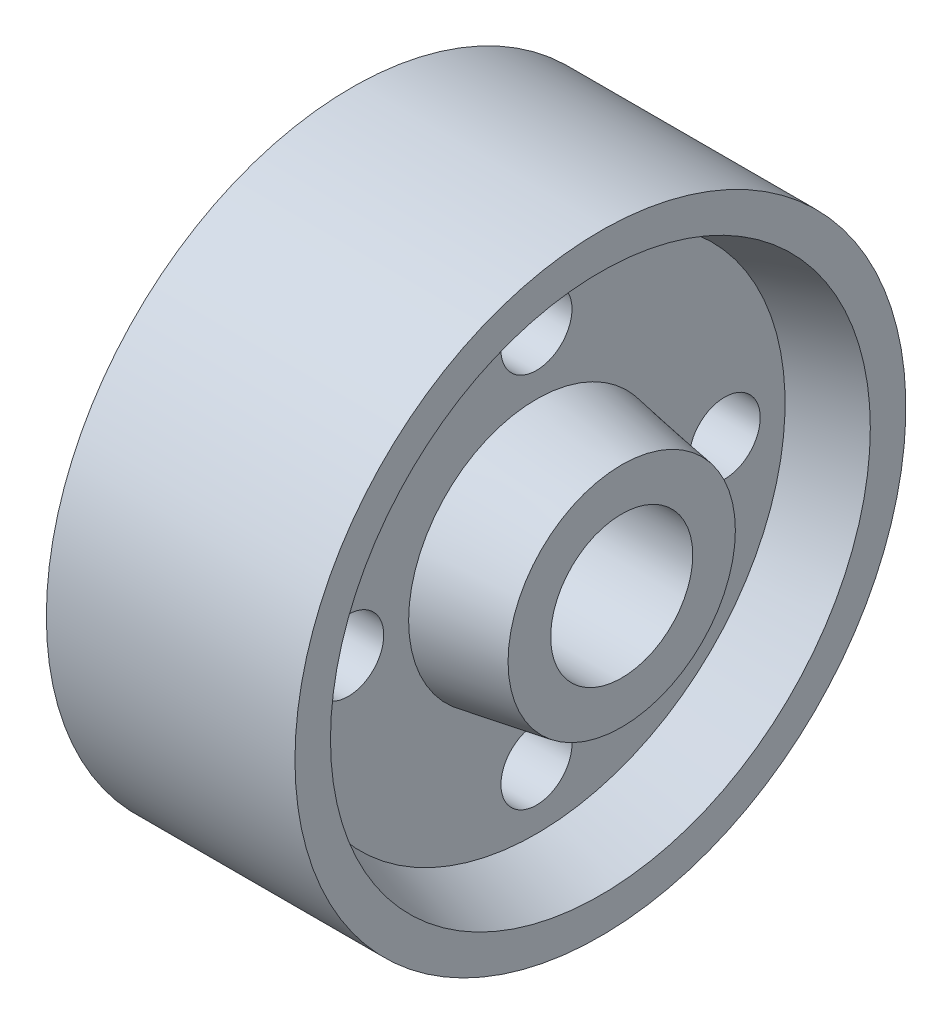
ISO-10303-21;
HEADER;
FILE_DESCRIPTION(('STEP AP214'),'2;1');
FILE_NAME('part.step','',(''),(''),'','','');
FILE_SCHEMA(('AUTOMOTIVE_DESIGN { 1 0 10303 214 1 1 1 1 }'));
ENDSEC;
DATA;
#1=APPLICATION_CONTEXT('core data for automotive mechanical design processes');
#2=APPLICATION_PROTOCOL_DEFINITION('international standard','automotive_design',2000,#1);
#3=PRODUCT_CONTEXT('',#1,'mechanical');
#4=PRODUCT('Part','Part','',(#3));
#5=PRODUCT_RELATED_PRODUCT_CATEGORY('part','',(#4));
#6=PRODUCT_DEFINITION_FORMATION('','',#4);
#7=PRODUCT_DEFINITION_CONTEXT('part definition',#1,'design');
#8=PRODUCT_DEFINITION('design','',#6,#7);
#9=PRODUCT_DEFINITION_SHAPE('','',#8);
#10=(LENGTH_UNIT() NAMED_UNIT(*) SI_UNIT(.MILLI.,.METRE.));
#11=(NAMED_UNIT(*) PLANE_ANGLE_UNIT() SI_UNIT($,.RADIAN.));
#12=(NAMED_UNIT(*) SI_UNIT($,.STERADIAN.) SOLID_ANGLE_UNIT());
#13=UNCERTAINTY_MEASURE_WITH_UNIT(LENGTH_MEASURE(1.E-05),#10,'distance_accuracy_value','');
#14=(GEOMETRIC_REPRESENTATION_CONTEXT(3) GLOBAL_UNCERTAINTY_ASSIGNED_CONTEXT((#13)) GLOBAL_UNIT_ASSIGNED_CONTEXT((#10,
#11,#12)) REPRESENTATION_CONTEXT('',''));
#15=CARTESIAN_POINT('',(0.,0.,0.));
#16=DIRECTION('',(0.,0.,1.));
#17=DIRECTION('',(1.,0.,0.));
#18=AXIS2_PLACEMENT_3D('',#15,#16,#17);
#19=CARTESIAN_POINT('',(41.,0.,0.));
#20=DIRECTION('',(-1.,0.,0.));
#21=DIRECTION('',(0.,0.,1.));
#22=AXIS2_PLACEMENT_3D('',#19,#20,#21);
#23=PLANE('',#22);
#24=CARTESIAN_POINT('',(41.,0.,0.));
#25=DIRECTION('',(1.,0.,0.));
#26=DIRECTION('',(0.,0.,-1.));
#27=AXIS2_PLACEMENT_3D('',#24,#25,#26);
#28=CIRCLE('',#27,10.);
#29=CARTESIAN_POINT('',(41.,0.,-10.));
#30=VERTEX_POINT('',#29);
#31=EDGE_CURVE('E174',#30,#30,#28,.T.);
#32=ORIENTED_EDGE('',*,*,#31,.F.);
#33=EDGE_LOOP('',(#32));
#34=FACE_BOUND('',#33,.T.);
#35=CARTESIAN_POINT('',(41.,0.,0.));
#36=DIRECTION('',(-1.,0.,0.));
#37=DIRECTION('',(0.,0.,1.));
#38=AXIS2_PLACEMENT_3D('',#35,#36,#37);
#39=CIRCLE('',#38,16.);
#40=CARTESIAN_POINT('',(41.,0.,16.));
#41=VERTEX_POINT('',#40);
#42=EDGE_CURVE('E10',#41,#41,#39,.T.);
#43=ORIENTED_EDGE('',*,*,#42,.F.);
#44=EDGE_LOOP('',(#43));
#45=FACE_BOUND('',#44,.T.);
#46=ADVANCED_FACE('F37',(#34,#45),#23,.F.);
#47=CARTESIAN_POINT('',(41.,0.,0.));
#48=DIRECTION('',(-1.,0.,0.));
#49=DIRECTION('',(0.,0.,1.));
#50=AXIS2_PLACEMENT_3D('',#47,#48,#49);
#51=CONICAL_SURFACE('',#50,16.,0.165148677414627);
#52=CARTESIAN_POINT('',(29.,0.,0.));
#53=DIRECTION('',(-1.,0.,0.));
#54=DIRECTION('',(0.,0.,1.));
#55=AXIS2_PLACEMENT_3D('',#52,#53,#54);
#56=CIRCLE('',#55,18.);
#57=CARTESIAN_POINT('',(29.,0.,18.));
#58=VERTEX_POINT('',#57);
#59=EDGE_CURVE('E44',#58,#58,#56,.T.);
#60=ORIENTED_EDGE('',*,*,#59,.F.);
#61=EDGE_LOOP('',(#60));
#62=FACE_BOUND('',#61,.T.);
#63=ORIENTED_EDGE('',*,*,#42,.T.);
#64=EDGE_LOOP('',(#63));
#65=FACE_BOUND('',#64,.T.);
#66=ADVANCED_FACE('F106',(#62,#65),#51,.T.);
#67=CARTESIAN_POINT('',(29.,0.,-18.));
#68=DIRECTION('',(-1.,0.,0.));
#69=DIRECTION('',(0.,0.,1.));
#70=AXIS2_PLACEMENT_3D('',#67,#68,#69);
#71=PLANE('',#70);
#72=CARTESIAN_POINT('',(29.,26.5,0.));
#73=DIRECTION('',(-1.,0.,0.));
#74=DIRECTION('',(0.,0.,1.));
#75=AXIS2_PLACEMENT_3D('',#72,#73,#74);
#76=CIRCLE('',#75,5.);
#77=CARTESIAN_POINT('',(29.,26.5,4.99999999999999));
#78=VERTEX_POINT('',#77);
#79=EDGE_CURVE('E75',#78,#78,#76,.T.);
#80=ORIENTED_EDGE('',*,*,#79,.T.);
#81=EDGE_LOOP('',(#80));
#82=FACE_BOUND('',#81,.T.);
#83=CARTESIAN_POINT('',(29.,0.,-26.5));
#84=DIRECTION('',(-1.,0.,0.));
#85=DIRECTION('',(0.,0.,1.));
#86=AXIS2_PLACEMENT_3D('',#83,#84,#85);
#87=CIRCLE('',#86,5.);
#88=CARTESIAN_POINT('',(29.,0.,-21.5));
#89=VERTEX_POINT('',#88);
#90=EDGE_CURVE('E63',#89,#89,#87,.T.);
#91=ORIENTED_EDGE('',*,*,#90,.T.);
#92=EDGE_LOOP('',(#91));
#93=FACE_BOUND('',#92,.T.);
#94=CARTESIAN_POINT('',(29.,-26.5,0.));
#95=DIRECTION('',(-1.,0.,0.));
#96=DIRECTION('',(0.,0.,1.));
#97=AXIS2_PLACEMENT_3D('',#94,#95,#96);
#98=CIRCLE('',#97,5.);
#99=CARTESIAN_POINT('',(29.,-26.5,4.99999999999999));
#100=VERTEX_POINT('',#99);
#101=EDGE_CURVE('E60',#100,#100,#98,.T.);
#102=ORIENTED_EDGE('',*,*,#101,.T.);
#103=EDGE_LOOP('',(#102));
#104=FACE_BOUND('',#103,.T.);
#105=CARTESIAN_POINT('',(29.,0.,26.5));
#106=DIRECTION('',(-1.,0.,0.));
#107=DIRECTION('',(0.,0.,1.));
#108=AXIS2_PLACEMENT_3D('',#105,#106,#107);
#109=CIRCLE('',#108,5.);
#110=CARTESIAN_POINT('',(29.,0.,31.5));
#111=VERTEX_POINT('',#110);
#112=EDGE_CURVE('E56',#111,#111,#109,.T.);
#113=ORIENTED_EDGE('',*,*,#112,.T.);
#114=EDGE_LOOP('',(#113));
#115=FACE_BOUND('',#114,.T.);
#116=CARTESIAN_POINT('',(29.,0.,0.));
#117=DIRECTION('',(-1.,0.,0.));
#118=DIRECTION('',(0.,0.,1.));
#119=AXIS2_PLACEMENT_3D('',#116,#117,#118);
#120=CIRCLE('',#119,35.);
#121=CARTESIAN_POINT('',(29.,0.,35.));
#122=VERTEX_POINT('',#121);
#123=EDGE_CURVE('E49',#122,#122,#120,.T.);
#124=ORIENTED_EDGE('',*,*,#123,.F.);
#125=EDGE_LOOP('',(#124));
#126=FACE_BOUND('',#125,.T.);
#127=ORIENTED_EDGE('',*,*,#59,.T.);
#128=EDGE_LOOP('',(#127));
#129=FACE_BOUND('',#128,.T.);
#130=ADVANCED_FACE('F103',(#82,#93,#104,#115,#126,#129),#71,.F.);
#131=CARTESIAN_POINT('',(29.,0.,0.));
#132=DIRECTION('',(1.,0.,0.));
#133=DIRECTION('',(0.,0.,-1.));
#134=AXIS2_PLACEMENT_3D('',#131,#132,#133);
#135=CONICAL_SURFACE('',#134,35.,0.321750554396641);
#136=CARTESIAN_POINT('',(38.,0.,0.));
#137=DIRECTION('',(-1.,0.,0.));
#138=DIRECTION('',(0.,0.,1.));
#139=AXIS2_PLACEMENT_3D('',#136,#137,#138);
#140=CIRCLE('',#139,38.);
#141=CARTESIAN_POINT('',(38.,0.,38.));
#142=VERTEX_POINT('',#141);
#143=EDGE_CURVE('E96',#142,#142,#140,.T.);
#144=ORIENTED_EDGE('',*,*,#143,.F.);
#145=EDGE_LOOP('',(#144));
#146=FACE_BOUND('',#145,.T.);
#147=ORIENTED_EDGE('',*,*,#123,.T.);
#148=EDGE_LOOP('',(#147));
#149=FACE_BOUND('',#148,.T.);
#150=ADVANCED_FACE('F101',(#146,#149),#135,.F.);
#151=CARTESIAN_POINT('',(38.,0.,-38.));
#152=DIRECTION('',(-1.,0.,0.));
#153=DIRECTION('',(0.,0.,1.));
#154=AXIS2_PLACEMENT_3D('',#151,#152,#153);
#155=PLANE('',#154);
#156=CARTESIAN_POINT('',(38.,0.,0.));
#157=DIRECTION('',(-1.,0.,0.));
#158=DIRECTION('',(0.,0.,1.));
#159=AXIS2_PLACEMENT_3D('',#156,#157,#158);
#160=CIRCLE('',#159,43.);
#161=CARTESIAN_POINT('',(38.,0.,43.));
#162=VERTEX_POINT('',#161);
#163=EDGE_CURVE('E93',#162,#162,#160,.T.);
#164=ORIENTED_EDGE('',*,*,#163,.F.);
#165=EDGE_LOOP('',(#164));
#166=FACE_BOUND('',#165,.T.);
#167=ORIENTED_EDGE('',*,*,#143,.T.);
#168=EDGE_LOOP('',(#167));
#169=FACE_BOUND('',#168,.T.);
#170=ADVANCED_FACE('F119',(#166,#169),#155,.F.);
#171=CARTESIAN_POINT('',(0.,0.,0.));
#172=DIRECTION('',(-1.,0.,0.));
#173=DIRECTION('',(0.,0.,1.));
#174=AXIS2_PLACEMENT_3D('',#171,#172,#173);
#175=CYLINDRICAL_SURFACE('',#174,43.);
#176=CARTESIAN_POINT('',(3.,0.,0.));
#177=DIRECTION('',(-1.,0.,0.));
#178=DIRECTION('',(0.,0.,1.));
#179=AXIS2_PLACEMENT_3D('',#176,#177,#178);
#180=CIRCLE('',#179,43.);
#181=CARTESIAN_POINT('',(3.00000000000002,0.,43.));
#182=VERTEX_POINT('',#181);
#183=EDGE_CURVE('E90',#182,#182,#180,.T.);
#184=ORIENTED_EDGE('',*,*,#183,.F.);
#185=EDGE_LOOP('',(#184));
#186=FACE_BOUND('',#185,.T.);
#187=ORIENTED_EDGE('',*,*,#163,.T.);
#188=EDGE_LOOP('',(#187));
#189=FACE_BOUND('',#188,.T.);
#190=ADVANCED_FACE('F123',(#186,#189),#175,.T.);
#191=CARTESIAN_POINT('',(2.99999999999999,0.,-38.));
#192=DIRECTION('',(1.,0.,0.));
#193=DIRECTION('',(0.,0.,-1.));
#194=AXIS2_PLACEMENT_3D('',#191,#192,#193);
#195=PLANE('',#194);
#196=CARTESIAN_POINT('',(3.,0.,0.));
#197=DIRECTION('',(-1.,0.,0.));
#198=DIRECTION('',(0.,0.,1.));
#199=AXIS2_PLACEMENT_3D('',#196,#197,#198);
#200=CIRCLE('',#199,38.);
#201=CARTESIAN_POINT('',(3.00000000000001,0.,38.));
#202=VERTEX_POINT('',#201);
#203=EDGE_CURVE('E87',#202,#202,#200,.T.);
#204=ORIENTED_EDGE('',*,*,#203,.F.);
#205=EDGE_LOOP('',(#204));
#206=FACE_BOUND('',#205,.T.);
#207=ORIENTED_EDGE('',*,*,#183,.T.);
#208=EDGE_LOOP('',(#207));
#209=FACE_BOUND('',#208,.T.);
#210=ADVANCED_FACE('F127',(#206,#209),#195,.F.);
#211=CARTESIAN_POINT('',(3.,0.,0.));
#212=DIRECTION('',(-1.,0.,0.));
#213=DIRECTION('',(0.,0.,1.));
#214=AXIS2_PLACEMENT_3D('',#211,#212,#213);
#215=CONICAL_SURFACE('',#214,38.,0.321750554396642);
#216=CARTESIAN_POINT('',(12.,0.,0.));
#217=DIRECTION('',(-1.,0.,0.));
#218=DIRECTION('',(0.,0.,1.));
#219=AXIS2_PLACEMENT_3D('',#216,#217,#218);
#220=CIRCLE('',#219,35.);
#221=CARTESIAN_POINT('',(12.,0.,35.));
#222=VERTEX_POINT('',#221);
#223=EDGE_CURVE('E84',#222,#222,#220,.T.);
#224=ORIENTED_EDGE('',*,*,#223,.F.);
#225=EDGE_LOOP('',(#224));
#226=FACE_BOUND('',#225,.T.);
#227=ORIENTED_EDGE('',*,*,#203,.T.);
#228=EDGE_LOOP('',(#227));
#229=FACE_BOUND('',#228,.T.);
#230=ADVANCED_FACE('F131',(#226,#229),#215,.F.);
#231=CARTESIAN_POINT('',(12.,0.,-18.));
#232=DIRECTION('',(1.,0.,0.));
#233=DIRECTION('',(0.,0.,-1.));
#234=AXIS2_PLACEMENT_3D('',#231,#232,#233);
#235=PLANE('',#234);
#236=CARTESIAN_POINT('',(12.,26.5,0.));
#237=DIRECTION('',(1.,0.,0.));
#238=DIRECTION('',(0.,0.,-1.));
#239=AXIS2_PLACEMENT_3D('',#236,#237,#238);
#240=CIRCLE('',#239,5.);
#241=CARTESIAN_POINT('',(12.,26.5,-5.00000000000001));
#242=VERTEX_POINT('',#241);
#243=EDGE_CURVE('E40',#242,#242,#240,.T.);
#244=ORIENTED_EDGE('',*,*,#243,.T.);
#245=EDGE_LOOP('',(#244));
#246=FACE_BOUND('',#245,.T.);
#247=CARTESIAN_POINT('',(12.,0.,-26.5));
#248=DIRECTION('',(1.,0.,0.));
#249=DIRECTION('',(0.,0.,-1.));
#250=AXIS2_PLACEMENT_3D('',#247,#248,#249);
#251=CIRCLE('',#250,5.);
#252=CARTESIAN_POINT('',(12.,0.,-31.5));
#253=VERTEX_POINT('',#252);
#254=EDGE_CURVE('E61',#253,#253,#251,.T.);
#255=ORIENTED_EDGE('',*,*,#254,.T.);
#256=EDGE_LOOP('',(#255));
#257=FACE_BOUND('',#256,.T.);
#258=CARTESIAN_POINT('',(12.,-26.5,0.));
#259=DIRECTION('',(1.,0.,0.));
#260=DIRECTION('',(0.,0.,-1.));
#261=AXIS2_PLACEMENT_3D('',#258,#259,#260);
#262=CIRCLE('',#261,5.);
#263=CARTESIAN_POINT('',(12.,-26.5,-5.00000000000001));
#264=VERTEX_POINT('',#263);
#265=EDGE_CURVE('E58',#264,#264,#262,.T.);
#266=ORIENTED_EDGE('',*,*,#265,.T.);
#267=EDGE_LOOP('',(#266));
#268=FACE_BOUND('',#267,.T.);
#269=CARTESIAN_POINT('',(12.,0.,26.5));
#270=DIRECTION('',(1.,0.,0.));
#271=DIRECTION('',(0.,0.,-1.));
#272=AXIS2_PLACEMENT_3D('',#269,#270,#271);
#273=CIRCLE('',#272,5.);
#274=CARTESIAN_POINT('',(12.,0.,21.5));
#275=VERTEX_POINT('',#274);
#276=EDGE_CURVE('E53',#275,#275,#273,.T.);
#277=ORIENTED_EDGE('',*,*,#276,.T.);
#278=EDGE_LOOP('',(#277));
#279=FACE_BOUND('',#278,.T.);
#280=CARTESIAN_POINT('',(12.,0.,0.));
#281=DIRECTION('',(-1.,0.,0.));
#282=DIRECTION('',(0.,0.,1.));
#283=AXIS2_PLACEMENT_3D('',#280,#281,#282);
#284=CIRCLE('',#283,18.);
#285=CARTESIAN_POINT('',(12.,0.,18.));
#286=VERTEX_POINT('',#285);
#287=EDGE_CURVE('E81',#286,#286,#284,.T.);
#288=ORIENTED_EDGE('',*,*,#287,.F.);
#289=EDGE_LOOP('',(#288));
#290=FACE_BOUND('',#289,.T.);
#291=ORIENTED_EDGE('',*,*,#223,.T.);
#292=EDGE_LOOP('',(#291));
#293=FACE_BOUND('',#292,.T.);
#294=ADVANCED_FACE('F135',(#246,#257,#268,#279,#290,#293),#235,.F.);
#295=CARTESIAN_POINT('',(12.,0.,0.));
#296=DIRECTION('',(1.,0.,0.));
#297=DIRECTION('',(0.,0.,-1.));
#298=AXIS2_PLACEMENT_3D('',#295,#296,#297);
#299=CONICAL_SURFACE('',#298,18.,0.165148677414627);
#300=CARTESIAN_POINT('',(0.,0.,0.));
#301=DIRECTION('',(-1.,0.,0.));
#302=DIRECTION('',(0.,0.,1.));
#303=AXIS2_PLACEMENT_3D('',#300,#301,#302);
#304=CIRCLE('',#303,16.);
#305=CARTESIAN_POINT('',(0.,0.,16.));
#306=VERTEX_POINT('',#305);
#307=EDGE_CURVE('E78',#306,#306,#304,.T.);
#308=ORIENTED_EDGE('',*,*,#307,.F.);
#309=EDGE_LOOP('',(#308));
#310=FACE_BOUND('',#309,.T.);
#311=ORIENTED_EDGE('',*,*,#287,.T.);
#312=EDGE_LOOP('',(#311));
#313=FACE_BOUND('',#312,.T.);
#314=ADVANCED_FACE('F139',(#310,#313),#299,.T.);
#315=CARTESIAN_POINT('',(0.,0.,0.));
#316=DIRECTION('',(1.,0.,0.));
#317=DIRECTION('',(0.,0.,-1.));
#318=AXIS2_PLACEMENT_3D('',#315,#316,#317);
#319=PLANE('',#318);
#320=CARTESIAN_POINT('',(0.,0.,0.));
#321=DIRECTION('',(1.,0.,0.));
#322=DIRECTION('',(0.,0.,-1.));
#323=AXIS2_PLACEMENT_3D('',#320,#321,#322);
#324=CIRCLE('',#323,10.);
#325=CARTESIAN_POINT('',(0.,0.,-10.));
#326=VERTEX_POINT('',#325);
#327=EDGE_CURVE('E57',#326,#326,#324,.T.);
#328=ORIENTED_EDGE('',*,*,#327,.T.);
#329=EDGE_LOOP('',(#328));
#330=FACE_BOUND('',#329,.T.);
#331=ORIENTED_EDGE('',*,*,#307,.T.);
#332=EDGE_LOOP('',(#331));
#333=FACE_BOUND('',#332,.T.);
#334=ADVANCED_FACE('F143',(#330,#333),#319,.F.);
#335=CARTESIAN_POINT('',(0.,0.,26.5));
#336=DIRECTION('',(1.,0.,0.));
#337=DIRECTION('',(0.,0.,-1.));
#338=AXIS2_PLACEMENT_3D('',#335,#336,#337);
#339=CYLINDRICAL_SURFACE('',#338,5.);
#340=ORIENTED_EDGE('',*,*,#276,.F.);
#341=EDGE_LOOP('',(#340));
#342=FACE_BOUND('',#341,.T.);
#343=ORIENTED_EDGE('',*,*,#112,.F.);
#344=EDGE_LOOP('',(#343));
#345=FACE_BOUND('',#344,.T.);
#346=ADVANCED_FACE('F147',(#342,#345),#339,.F.);
#347=CARTESIAN_POINT('',(0.,-26.5,0.));
#348=DIRECTION('',(1.,0.,0.));
#349=DIRECTION('',(0.,0.,-1.));
#350=AXIS2_PLACEMENT_3D('',#347,#348,#349);
#351=CYLINDRICAL_SURFACE('',#350,5.);
#352=ORIENTED_EDGE('',*,*,#265,.F.);
#353=EDGE_LOOP('',(#352));
#354=FACE_BOUND('',#353,.T.);
#355=ORIENTED_EDGE('',*,*,#101,.F.);
#356=EDGE_LOOP('',(#355));
#357=FACE_BOUND('',#356,.T.);
#358=ADVANCED_FACE('F151',(#354,#357),#351,.F.);
#359=CARTESIAN_POINT('',(0.,0.,-26.5));
#360=DIRECTION('',(1.,0.,0.));
#361=DIRECTION('',(0.,0.,-1.));
#362=AXIS2_PLACEMENT_3D('',#359,#360,#361);
#363=CYLINDRICAL_SURFACE('',#362,5.);
#364=ORIENTED_EDGE('',*,*,#254,.F.);
#365=EDGE_LOOP('',(#364));
#366=FACE_BOUND('',#365,.T.);
#367=ORIENTED_EDGE('',*,*,#90,.F.);
#368=EDGE_LOOP('',(#367));
#369=FACE_BOUND('',#368,.T.);
#370=ADVANCED_FACE('F155',(#366,#369),#363,.F.);
#371=CARTESIAN_POINT('',(0.,26.5,0.));
#372=DIRECTION('',(1.,0.,0.));
#373=DIRECTION('',(0.,0.,-1.));
#374=AXIS2_PLACEMENT_3D('',#371,#372,#373);
#375=CYLINDRICAL_SURFACE('',#374,5.);
#376=ORIENTED_EDGE('',*,*,#243,.F.);
#377=EDGE_LOOP('',(#376));
#378=FACE_BOUND('',#377,.T.);
#379=ORIENTED_EDGE('',*,*,#79,.F.);
#380=EDGE_LOOP('',(#379));
#381=FACE_BOUND('',#380,.T.);
#382=ADVANCED_FACE('F159',(#378,#381),#375,.F.);
#383=CARTESIAN_POINT('',(0.,0.,0.));
#384=DIRECTION('',(1.,0.,0.));
#385=DIRECTION('',(0.,0.,-1.));
#386=AXIS2_PLACEMENT_3D('',#383,#384,#385);
#387=CYLINDRICAL_SURFACE('',#386,10.);
#388=ORIENTED_EDGE('',*,*,#327,.F.);
#389=EDGE_LOOP('',(#388));
#390=FACE_BOUND('',#389,.T.);
#391=ORIENTED_EDGE('',*,*,#31,.T.);
#392=EDGE_LOOP('',(#391));
#393=FACE_BOUND('',#392,.T.);
#394=ADVANCED_FACE('F163',(#390,#393),#387,.F.);
#395=CLOSED_SHELL('',(#46,#66,#130,#150,#170,#190,#210,#230,#294,#314,#334,#346,#358,#370,#382,#394));
#396=MANIFOLD_SOLID_BREP('B2',#395);
#397=ADVANCED_BREP_SHAPE_REPRESENTATION('',(#18,#396),#14);
#398=SHAPE_DEFINITION_REPRESENTATION(#9,#397);
ENDSEC;
END-ISO-10303-21;
